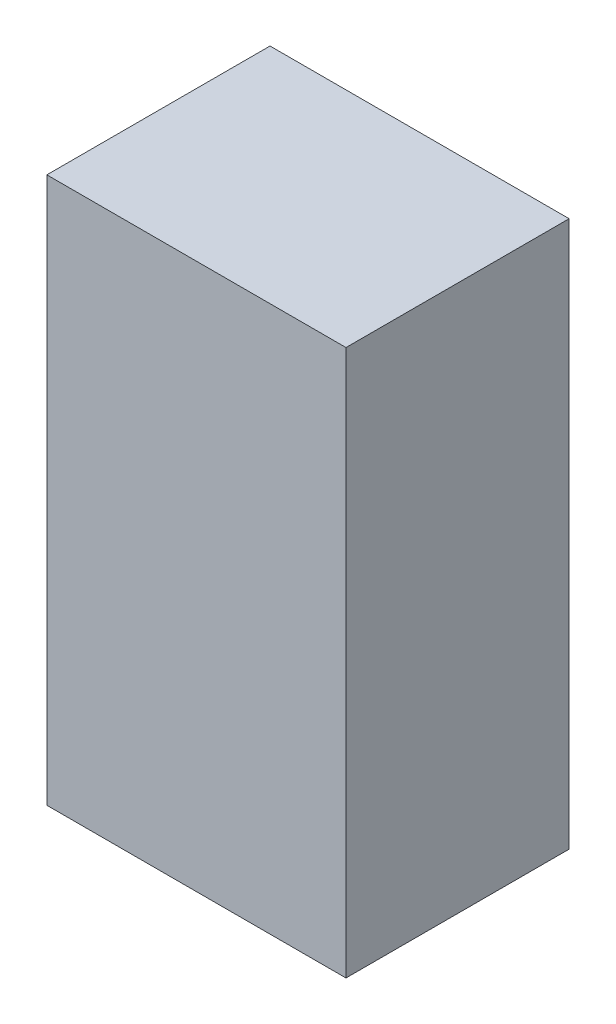
ISO-10303-21;
HEADER;
FILE_DESCRIPTION(('STEP AP214'),'2;1');
FILE_NAME('part.step','',(''),(''),'','','');
FILE_SCHEMA(('AUTOMOTIVE_DESIGN { 1 0 10303 214 1 1 1 1 }'));
ENDSEC;
DATA;
#1=APPLICATION_CONTEXT('core data for automotive mechanical design processes');
#2=APPLICATION_PROTOCOL_DEFINITION('international standard','automotive_design',2000,#1);
#3=PRODUCT_CONTEXT('',#1,'mechanical');
#4=PRODUCT('Part','Part','',(#3));
#5=PRODUCT_RELATED_PRODUCT_CATEGORY('part','',(#4));
#6=PRODUCT_DEFINITION_FORMATION('','',#4);
#7=PRODUCT_DEFINITION_CONTEXT('part definition',#1,'design');
#8=PRODUCT_DEFINITION('design','',#6,#7);
#9=PRODUCT_DEFINITION_SHAPE('','',#8);
#10=(LENGTH_UNIT() NAMED_UNIT(*) SI_UNIT(.MILLI.,.METRE.));
#11=(NAMED_UNIT(*) PLANE_ANGLE_UNIT() SI_UNIT($,.RADIAN.));
#12=(NAMED_UNIT(*) SI_UNIT($,.STERADIAN.) SOLID_ANGLE_UNIT());
#13=UNCERTAINTY_MEASURE_WITH_UNIT(LENGTH_MEASURE(1.E-05),#10,'distance_accuracy_value','');
#14=(GEOMETRIC_REPRESENTATION_CONTEXT(3) GLOBAL_UNCERTAINTY_ASSIGNED_CONTEXT((#13)) GLOBAL_UNIT_ASSIGNED_CONTEXT((#10,
#11,#12)) REPRESENTATION_CONTEXT('',''));
#15=CARTESIAN_POINT('',(0.,0.,0.));
#16=DIRECTION('',(0.,0.,1.));
#17=DIRECTION('',(1.,0.,0.));
#18=AXIS2_PLACEMENT_3D('',#15,#16,#17);
#19=CARTESIAN_POINT('',(-1.6002,-2.921,2.3876));
#20=DIRECTION('',(0.,0.,-1.));
#21=DIRECTION('',(-1.,0.,0.));
#22=AXIS2_PLACEMENT_3D('',#19,#20,#21);
#23=PLANE('',#22);
#24=DIRECTION('',(0.,1.,0.));
#25=VECTOR('',#24,1.);
#26=CARTESIAN_POINT('',(1.6002,-2.921,2.3876));
#27=LINE('',#26,#25);
#28=CARTESIAN_POINT('',(1.6002,-2.921,2.3876));
#29=VERTEX_POINT('',#28);
#30=CARTESIAN_POINT('',(1.6002,2.921,2.3876));
#31=VERTEX_POINT('',#30);
#32=EDGE_CURVE('E55',#29,#31,#27,.T.);
#33=ORIENTED_EDGE('',*,*,#32,.T.);
#34=DIRECTION('',(1.,0.,0.));
#35=VECTOR('',#34,1.);
#36=CARTESIAN_POINT('',(1.6002,2.921,2.3876));
#37=LINE('',#36,#35);
#38=CARTESIAN_POINT('',(-1.6002,2.921,2.3876));
#39=VERTEX_POINT('',#38);
#40=EDGE_CURVE('E57',#31,#39,#37,.F.);
#41=ORIENTED_EDGE('',*,*,#40,.T.);
#42=DIRECTION('',(0.,1.,0.));
#43=VECTOR('',#42,1.);
#44=CARTESIAN_POINT('',(-1.6002,2.921,2.3876));
#45=LINE('',#44,#43);
#46=CARTESIAN_POINT('',(-1.6002,-2.921,2.3876));
#47=VERTEX_POINT('',#46);
#48=EDGE_CURVE('E20',#39,#47,#45,.F.);
#49=ORIENTED_EDGE('',*,*,#48,.T.);
#50=DIRECTION('',(1.,0.,0.));
#51=VECTOR('',#50,1.);
#52=CARTESIAN_POINT('',(-1.6002,-2.921,2.3876));
#53=LINE('',#52,#51);
#54=EDGE_CURVE('E80',#47,#29,#53,.T.);
#55=ORIENTED_EDGE('',*,*,#54,.T.);
#56=EDGE_LOOP('',(#33,#41,#49,#55));
#57=FACE_BOUND('',#56,.T.);
#58=ADVANCED_FACE('F17',(#57),#23,.F.);
#59=CARTESIAN_POINT('',(-1.6002,2.921,0.));
#60=DIRECTION('',(1.,0.,0.));
#61=DIRECTION('',(0.,0.,-1.));
#62=AXIS2_PLACEMENT_3D('',#59,#60,#61);
#63=PLANE('',#62);
#64=DIRECTION('',(0.,0.,1.));
#65=VECTOR('',#64,1.);
#66=CARTESIAN_POINT('',(-1.6002,-2.921,0.));
#67=LINE('',#66,#65);
#68=CARTESIAN_POINT('',(-1.6002,-2.921,0.));
#69=VERTEX_POINT('',#68);
#70=EDGE_CURVE('E68',#69,#47,#67,.T.);
#71=ORIENTED_EDGE('',*,*,#70,.T.);
#72=ORIENTED_EDGE('',*,*,#48,.F.);
#73=DIRECTION('',(0.,0.,-1.));
#74=VECTOR('',#73,1.);
#75=CARTESIAN_POINT('',(-1.6002,2.921,0.));
#76=LINE('',#75,#74);
#77=CARTESIAN_POINT('',(-1.6002,2.921,0.));
#78=VERTEX_POINT('',#77);
#79=EDGE_CURVE('E63',#39,#78,#76,.T.);
#80=ORIENTED_EDGE('',*,*,#79,.T.);
#81=DIRECTION('',(0.,1.,0.));
#82=VECTOR('',#81,1.);
#83=CARTESIAN_POINT('',(-1.6002,-2.921,0.));
#84=LINE('',#83,#82);
#85=EDGE_CURVE('E83',#69,#78,#84,.T.);
#86=ORIENTED_EDGE('',*,*,#85,.F.);
#87=EDGE_LOOP('',(#71,#72,#80,#86));
#88=FACE_BOUND('',#87,.T.);
#89=ADVANCED_FACE('F65',(#88),#63,.F.);
#90=CARTESIAN_POINT('',(1.6002,2.921,0.));
#91=DIRECTION('',(0.,-1.,0.));
#92=DIRECTION('',(0.,0.,-1.));
#93=AXIS2_PLACEMENT_3D('',#90,#91,#92);
#94=PLANE('',#93);
#95=ORIENTED_EDGE('',*,*,#79,.F.);
#96=ORIENTED_EDGE('',*,*,#40,.F.);
#97=DIRECTION('',(0.,0.,1.));
#98=VECTOR('',#97,1.);
#99=CARTESIAN_POINT('',(1.6002,2.921,0.));
#100=LINE('',#99,#98);
#101=CARTESIAN_POINT('',(1.6002,2.921,0.));
#102=VERTEX_POINT('',#101);
#103=EDGE_CURVE('E75',#31,#102,#100,.F.);
#104=ORIENTED_EDGE('',*,*,#103,.T.);
#105=DIRECTION('',(-1.,0.,0.));
#106=VECTOR('',#105,1.);
#107=CARTESIAN_POINT('',(-1.6002,2.921,0.));
#108=LINE('',#107,#106);
#109=EDGE_CURVE('E72',#78,#102,#108,.F.);
#110=ORIENTED_EDGE('',*,*,#109,.F.);
#111=EDGE_LOOP('',(#95,#96,#104,#110));
#112=FACE_BOUND('',#111,.T.);
#113=ADVANCED_FACE('F70',(#112),#94,.F.);
#114=CARTESIAN_POINT('',(1.6002,-2.921,0.));
#115=DIRECTION('',(-1.,0.,0.));
#116=DIRECTION('',(0.,0.,1.));
#117=AXIS2_PLACEMENT_3D('',#114,#115,#116);
#118=PLANE('',#117);
#119=ORIENTED_EDGE('',*,*,#103,.F.);
#120=ORIENTED_EDGE('',*,*,#32,.F.);
#121=DIRECTION('',(0.,0.,1.));
#122=VECTOR('',#121,1.);
#123=CARTESIAN_POINT('',(1.6002,-2.921,0.));
#124=LINE('',#123,#122);
#125=CARTESIAN_POINT('',(1.6002,-2.921,0.));
#126=VERTEX_POINT('',#125);
#127=EDGE_CURVE('E35',#29,#126,#124,.F.);
#128=ORIENTED_EDGE('',*,*,#127,.T.);
#129=DIRECTION('',(0.,1.,0.));
#130=VECTOR('',#129,1.);
#131=CARTESIAN_POINT('',(1.6002,-2.921,0.));
#132=LINE('',#131,#130);
#133=EDGE_CURVE('E26',#102,#126,#132,.F.);
#134=ORIENTED_EDGE('',*,*,#133,.F.);
#135=EDGE_LOOP('',(#119,#120,#128,#134));
#136=FACE_BOUND('',#135,.T.);
#137=ADVANCED_FACE('F89',(#136),#118,.F.);
#138=CARTESIAN_POINT('',(-1.6002,-2.921,0.));
#139=DIRECTION('',(0.,1.,0.));
#140=DIRECTION('',(0.,0.,1.));
#141=AXIS2_PLACEMENT_3D('',#138,#139,#140);
#142=PLANE('',#141);
#143=ORIENTED_EDGE('',*,*,#127,.F.);
#144=ORIENTED_EDGE('',*,*,#54,.F.);
#145=ORIENTED_EDGE('',*,*,#70,.F.);
#146=DIRECTION('',(-1.,0.,0.));
#147=VECTOR('',#146,1.);
#148=CARTESIAN_POINT('',(-1.6002,-2.921,0.));
#149=LINE('',#148,#147);
#150=EDGE_CURVE('E11',#126,#69,#149,.T.);
#151=ORIENTED_EDGE('',*,*,#150,.F.);
#152=EDGE_LOOP('',(#143,#144,#145,#151));
#153=FACE_BOUND('',#152,.T.);
#154=ADVANCED_FACE('F91',(#153),#142,.F.);
#155=CARTESIAN_POINT('',(-1.6002,-2.921,0.));
#156=DIRECTION('',(0.,0.,-1.));
#157=DIRECTION('',(-1.,0.,0.));
#158=AXIS2_PLACEMENT_3D('',#155,#156,#157);
#159=PLANE('',#158);
#160=ORIENTED_EDGE('',*,*,#133,.T.);
#161=ORIENTED_EDGE('',*,*,#150,.T.);
#162=ORIENTED_EDGE('',*,*,#85,.T.);
#163=ORIENTED_EDGE('',*,*,#109,.T.);
#164=EDGE_LOOP('',(#160,#161,#162,#163));
#165=FACE_BOUND('',#164,.T.);
#166=ADVANCED_FACE('F88',(#165),#159,.T.);
#167=CLOSED_SHELL('',(#58,#89,#113,#137,#154,#166));
#168=MANIFOLD_SOLID_BREP('B1',#167);
#169=ADVANCED_BREP_SHAPE_REPRESENTATION('',(#18,#168),#14);
#170=SHAPE_DEFINITION_REPRESENTATION(#9,#169);
ENDSEC;
END-ISO-10303-21;
